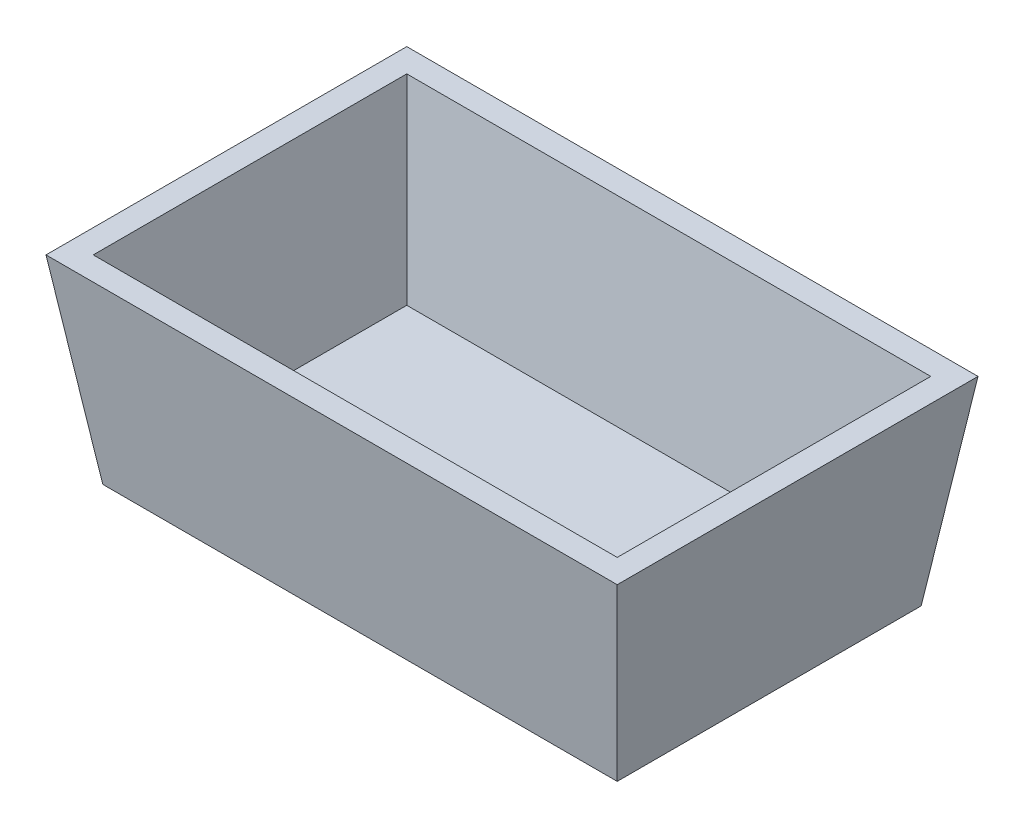
ISO-10303-21;
HEADER;
FILE_DESCRIPTION(('STEP AP214'),'2;1');
FILE_NAME('part.step','',(''),(''),'','','');
FILE_SCHEMA(('AUTOMOTIVE_DESIGN { 1 0 10303 214 1 1 1 1 }'));
ENDSEC;
DATA;
#1=APPLICATION_CONTEXT('core data for automotive mechanical design processes');
#2=APPLICATION_PROTOCOL_DEFINITION('international standard','automotive_design',2000,#1);
#3=PRODUCT_CONTEXT('',#1,'mechanical');
#4=PRODUCT('Part','Part','',(#3));
#5=PRODUCT_RELATED_PRODUCT_CATEGORY('part','',(#4));
#6=PRODUCT_DEFINITION_FORMATION('','',#4);
#7=PRODUCT_DEFINITION_CONTEXT('part definition',#1,'design');
#8=PRODUCT_DEFINITION('design','',#6,#7);
#9=PRODUCT_DEFINITION_SHAPE('','',#8);
#10=(LENGTH_UNIT() NAMED_UNIT(*) SI_UNIT(.MILLI.,.METRE.));
#11=(NAMED_UNIT(*) PLANE_ANGLE_UNIT() SI_UNIT($,.RADIAN.));
#12=(NAMED_UNIT(*) SI_UNIT($,.STERADIAN.) SOLID_ANGLE_UNIT());
#13=UNCERTAINTY_MEASURE_WITH_UNIT(LENGTH_MEASURE(1.E-05),#10,'distance_accuracy_value','');
#14=(GEOMETRIC_REPRESENTATION_CONTEXT(3) GLOBAL_UNCERTAINTY_ASSIGNED_CONTEXT((#13)) GLOBAL_UNIT_ASSIGNED_CONTEXT((#10,
#11,#12)) REPRESENTATION_CONTEXT('',''));
#15=CARTESIAN_POINT('',(0.,0.,0.));
#16=DIRECTION('',(0.,0.,1.));
#17=DIRECTION('',(1.,0.,0.));
#18=AXIS2_PLACEMENT_3D('',#15,#16,#17);
#19=CARTESIAN_POINT('',(0.,-46.2280000000001,-323.596));
#20=DIRECTION('',(0.,-0.14142135623731,-0.989949493661166));
#21=DIRECTION('',(0.,0.989949493661166,-0.14142135623731));
#22=AXIS2_PLACEMENT_3D('',#19,#20,#21);
#23=PLANE('',#22);
#24=DIRECTION('',(0.140028008402801,-0.980196058819607,0.140028008402801));
#25=VECTOR('',#24,1.);
#26=CARTESIAN_POINT('',(-38.1000000000001,266.7,-368.3));
#27=LINE('',#26,#25);
#28=CARTESIAN_POINT('',(-30.8428571428572,215.9,-361.042857142857));
#29=VERTEX_POINT('',#28);
#30=CARTESIAN_POINT('',(0.,0.,-330.2));
#31=VERTEX_POINT('',#30);
#32=EDGE_CURVE('E53',#29,#31,#27,.T.);
#33=ORIENTED_EDGE('',*,*,#32,.F.);
#34=DIRECTION('',(1.,0.,0.));
#35=VECTOR('',#34,1.);
#36=CARTESIAN_POINT('',(0.,215.9,-361.042857142857));
#37=LINE('',#36,#35);
#38=CARTESIAN_POINT('',(589.642857142857,215.9,-361.042857142857));
#39=VERTEX_POINT('',#38);
#40=EDGE_CURVE('E272',#29,#39,#37,.T.);
#41=ORIENTED_EDGE('',*,*,#40,.T.);
#42=DIRECTION('',(-0.140028008402801,-0.980196058819607,0.140028008402801));
#43=VECTOR('',#42,1.);
#44=CARTESIAN_POINT('',(596.9,266.7,-368.3));
#45=LINE('',#44,#43);
#46=CARTESIAN_POINT('',(558.8,0.,-330.2));
#47=VERTEX_POINT('',#46);
#48=EDGE_CURVE('E158',#39,#47,#45,.T.);
#49=ORIENTED_EDGE('',*,*,#48,.T.);
#50=DIRECTION('',(-1.,0.,0.));
#51=VECTOR('',#50,1.);
#52=CARTESIAN_POINT('',(0.,0.,-330.2));
#53=LINE('',#52,#51);
#54=EDGE_CURVE('E228',#47,#31,#53,.T.);
#55=ORIENTED_EDGE('',*,*,#54,.T.);
#56=EDGE_LOOP('',(#33,#41,#49,#55));
#57=FACE_BOUND('',#56,.T.);
#58=ADVANCED_FACE('F48',(#57),#23,.T.);
#59=CARTESIAN_POINT('',(0.,0.,0.));
#60=DIRECTION('',(-0.989949493661166,-0.14142135623731,0.));
#61=DIRECTION('',(0.14142135623731,-0.989949493661166,0.));
#62=AXIS2_PLACEMENT_3D('',#59,#60,#61);
#63=PLANE('',#62);
#64=DIRECTION('',(0.140028008402801,-0.980196058819607,-0.140028008402801));
#65=VECTOR('',#64,1.);
#66=CARTESIAN_POINT('',(-38.1000000000001,266.7,38.1));
#67=LINE('',#66,#65);
#68=CARTESIAN_POINT('',(-30.8428571428572,215.9,30.8428571428571));
#69=VERTEX_POINT('',#68);
#70=CARTESIAN_POINT('',(0.,0.,0.));
#71=VERTEX_POINT('',#70);
#72=EDGE_CURVE('E151',#69,#71,#67,.T.);
#73=ORIENTED_EDGE('',*,*,#72,.F.);
#74=DIRECTION('',(0.,0.,-1.));
#75=VECTOR('',#74,1.);
#76=CARTESIAN_POINT('',(-30.8428571428572,215.9,0.));
#77=LINE('',#76,#75);
#78=EDGE_CURVE('E68',#69,#29,#77,.T.);
#79=ORIENTED_EDGE('',*,*,#78,.T.);
#80=ORIENTED_EDGE('',*,*,#32,.T.);
#81=DIRECTION('',(0.,0.,1.));
#82=VECTOR('',#81,1.);
#83=CARTESIAN_POINT('',(0.,0.,0.));
#84=LINE('',#83,#82);
#85=EDGE_CURVE('E154',#31,#71,#84,.T.);
#86=ORIENTED_EDGE('',*,*,#85,.T.);
#87=EDGE_LOOP('',(#73,#79,#80,#86));
#88=FACE_BOUND('',#87,.T.);
#89=ADVANCED_FACE('F188',(#88),#63,.T.);
#90=CARTESIAN_POINT('',(547.624,-78.232,0.));
#91=DIRECTION('',(0.989949493661166,-0.14142135623731,0.));
#92=DIRECTION('',(0.14142135623731,0.989949493661167,0.));
#93=AXIS2_PLACEMENT_3D('',#90,#91,#92);
#94=PLANE('',#93);
#95=ORIENTED_EDGE('',*,*,#48,.F.);
#96=DIRECTION('',(0.,0.,1.));
#97=VECTOR('',#96,1.);
#98=CARTESIAN_POINT('',(589.642857142857,215.9,0.));
#99=LINE('',#98,#97);
#100=CARTESIAN_POINT('',(589.642857142857,215.9,30.8428571428571));
#101=VERTEX_POINT('',#100);
#102=EDGE_CURVE('E283',#39,#101,#99,.T.);
#103=ORIENTED_EDGE('',*,*,#102,.T.);
#104=DIRECTION('',(-0.140028008402801,-0.980196058819607,-0.140028008402801));
#105=VECTOR('',#104,1.);
#106=CARTESIAN_POINT('',(596.9,266.7,38.1));
#107=LINE('',#106,#105);
#108=CARTESIAN_POINT('',(558.8,0.,0.));
#109=VERTEX_POINT('',#108);
#110=EDGE_CURVE('E155',#101,#109,#107,.T.);
#111=ORIENTED_EDGE('',*,*,#110,.T.);
#112=DIRECTION('',(0.,0.,-1.));
#113=VECTOR('',#112,1.);
#114=CARTESIAN_POINT('',(558.8,0.,0.));
#115=LINE('',#114,#113);
#116=EDGE_CURVE('E212',#109,#47,#115,.T.);
#117=ORIENTED_EDGE('',*,*,#116,.T.);
#118=EDGE_LOOP('',(#95,#103,#111,#117));
#119=FACE_BOUND('',#118,.T.);
#120=ADVANCED_FACE('F184',(#119),#94,.T.);
#121=CARTESIAN_POINT('',(0.,0.,0.));
#122=DIRECTION('',(0.,-0.14142135623731,0.989949493661166));
#123=DIRECTION('',(0.,-0.989949493661167,-0.14142135623731));
#124=AXIS2_PLACEMENT_3D('',#121,#122,#123);
#125=PLANE('',#124);
#126=ORIENTED_EDGE('',*,*,#110,.F.);
#127=DIRECTION('',(-1.,0.,0.));
#128=VECTOR('',#127,1.);
#129=CARTESIAN_POINT('',(0.,215.9,30.8428571428571));
#130=LINE('',#129,#128);
#131=EDGE_CURVE('E289',#101,#69,#130,.T.);
#132=ORIENTED_EDGE('',*,*,#131,.T.);
#133=ORIENTED_EDGE('',*,*,#72,.T.);
#134=DIRECTION('',(1.,0.,0.));
#135=VECTOR('',#134,1.);
#136=CARTESIAN_POINT('',(0.,0.,0.));
#137=LINE('',#136,#135);
#138=EDGE_CURVE('E60',#71,#109,#137,.T.);
#139=ORIENTED_EDGE('',*,*,#138,.T.);
#140=EDGE_LOOP('',(#126,#132,#133,#139));
#141=FACE_BOUND('',#140,.T.);
#142=ADVANCED_FACE('F175',(#141),#125,.T.);
#143=CARTESIAN_POINT('',(0.,0.,0.));
#144=DIRECTION('',(0.,-1.,0.));
#145=DIRECTION('',(0.,0.,-1.));
#146=AXIS2_PLACEMENT_3D('',#143,#144,#145);
#147=PLANE('',#146);
#148=ORIENTED_EDGE('',*,*,#85,.F.);
#149=ORIENTED_EDGE('',*,*,#54,.F.);
#150=ORIENTED_EDGE('',*,*,#116,.F.);
#151=ORIENTED_EDGE('',*,*,#138,.F.);
#152=EDGE_LOOP('',(#148,#149,#150,#151));
#153=FACE_BOUND('',#152,.T.);
#154=ADVANCED_FACE('F50',(#153),#147,.T.);
#155=CARTESIAN_POINT('',(0.,215.9,0.));
#156=DIRECTION('',(0.,1.,0.));
#157=DIRECTION('',(0.,0.,1.));
#158=AXIS2_PLACEMENT_3D('',#155,#156,#157);
#159=PLANE('',#158);
#160=ORIENTED_EDGE('',*,*,#78,.F.);
#161=ORIENTED_EDGE('',*,*,#131,.F.);
#162=ORIENTED_EDGE('',*,*,#102,.F.);
#163=ORIENTED_EDGE('',*,*,#40,.F.);
#164=EDGE_LOOP('',(#160,#161,#162,#163));
#165=FACE_BOUND('',#164,.T.);
#166=DIRECTION('',(1.,0.,0.));
#167=VECTOR('',#166,1.);
#168=CARTESIAN_POINT('',(0.,215.9,-335.384982511231));
#169=LINE('',#168,#167);
#170=CARTESIAN_POINT('',(-5.18498251123106,215.9,-335.384982511231));
#171=VERTEX_POINT('',#170);
#172=CARTESIAN_POINT('',(563.984982511231,215.9,-335.384982511231));
#173=VERTEX_POINT('',#172);
#174=EDGE_CURVE('E129',#171,#173,#169,.T.);
#175=ORIENTED_EDGE('',*,*,#174,.T.);
#176=DIRECTION('',(0.,0.,1.));
#177=VECTOR('',#176,1.);
#178=CARTESIAN_POINT('',(563.984982511231,215.9,0.));
#179=LINE('',#178,#177);
#180=CARTESIAN_POINT('',(563.984982511231,215.9,5.18498251123099));
#181=VERTEX_POINT('',#180);
#182=EDGE_CURVE('E75',#173,#181,#179,.T.);
#183=ORIENTED_EDGE('',*,*,#182,.T.);
#184=DIRECTION('',(-1.,0.,0.));
#185=VECTOR('',#184,1.);
#186=CARTESIAN_POINT('',(0.,215.9,5.18498251123099));
#187=LINE('',#186,#185);
#188=CARTESIAN_POINT('',(-5.18498251123106,215.9,5.18498251123099));
#189=VERTEX_POINT('',#188);
#190=EDGE_CURVE('E12',#181,#189,#187,.T.);
#191=ORIENTED_EDGE('',*,*,#190,.T.);
#192=DIRECTION('',(0.,0.,-1.));
#193=VECTOR('',#192,1.);
#194=CARTESIAN_POINT('',(-5.18498251123106,215.9,0.));
#195=LINE('',#194,#193);
#196=EDGE_CURVE('E116',#189,#171,#195,.T.);
#197=ORIENTED_EDGE('',*,*,#196,.T.);
#198=EDGE_LOOP('',(#175,#183,#191,#197));
#199=FACE_BOUND('',#198,.T.);
#200=ADVANCED_FACE('F115',(#165,#199),#159,.T.);
#201=CARTESIAN_POINT('',(0.,25.4,0.));
#202=DIRECTION('',(0.,-1.,0.));
#203=DIRECTION('',(0.,0.,-1.));
#204=AXIS2_PLACEMENT_3D('',#201,#202,#203);
#205=PLANE('',#204);
#206=DIRECTION('',(0.,0.,1.));
#207=VECTOR('',#206,1.);
#208=CARTESIAN_POINT('',(22.0293032030547,25.4,0.));
#209=LINE('',#208,#207);
#210=CARTESIAN_POINT('',(22.0293032030547,25.4,-308.170696796945));
#211=VERTEX_POINT('',#210);
#212=CARTESIAN_POINT('',(22.0293032030547,25.4,-22.0293032030547));
#213=VERTEX_POINT('',#212);
#214=EDGE_CURVE('E136',#211,#213,#209,.T.);
#215=ORIENTED_EDGE('',*,*,#214,.T.);
#216=DIRECTION('',(1.,0.,0.));
#217=VECTOR('',#216,1.);
#218=CARTESIAN_POINT('',(0.,25.4,-22.0293032030547));
#219=LINE('',#218,#217);
#220=CARTESIAN_POINT('',(536.770696796945,25.4,-22.0293032030547));
#221=VERTEX_POINT('',#220);
#222=EDGE_CURVE('E133',#213,#221,#219,.T.);
#223=ORIENTED_EDGE('',*,*,#222,.T.);
#224=DIRECTION('',(0.,0.,-1.));
#225=VECTOR('',#224,1.);
#226=CARTESIAN_POINT('',(536.770696796945,25.4,0.));
#227=LINE('',#226,#225);
#228=CARTESIAN_POINT('',(536.770696796945,25.4,-308.170696796945));
#229=VERTEX_POINT('',#228);
#230=EDGE_CURVE('E260',#221,#229,#227,.T.);
#231=ORIENTED_EDGE('',*,*,#230,.T.);
#232=DIRECTION('',(-1.,0.,0.));
#233=VECTOR('',#232,1.);
#234=CARTESIAN_POINT('',(0.,25.4,-308.170696796945));
#235=LINE('',#234,#233);
#236=EDGE_CURVE('E141',#229,#211,#235,.T.);
#237=ORIENTED_EDGE('',*,*,#236,.T.);
#238=EDGE_LOOP('',(#215,#223,#231,#237));
#239=FACE_BOUND('',#238,.T.);
#240=ADVANCED_FACE('F329',(#239),#205,.F.);
#241=CARTESIAN_POINT('',(0.,3.59210244842766,-25.1447171389936));
#242=DIRECTION('',(0.,-0.14142135623731,0.989949493661166));
#243=DIRECTION('',(0.,-0.989949493661167,-0.14142135623731));
#244=AXIS2_PLACEMENT_3D('',#241,#242,#243);
#245=PLANE('',#244);
#246=ORIENTED_EDGE('',*,*,#190,.F.);
#247=DIRECTION('',(-0.140028008402801,-0.980196058819607,-0.140028008402801));
#248=VECTOR('',#247,1.);
#249=CARTESIAN_POINT('',(523.1914537853,-69.6547010815144,-35.6085462146996));
#250=LINE('',#249,#248);
#251=EDGE_CURVE('E137',#181,#221,#250,.T.);
#252=ORIENTED_EDGE('',*,*,#251,.T.);
#253=ORIENTED_EDGE('',*,*,#222,.F.);
#254=DIRECTION('',(0.140028008402801,-0.980196058819607,-0.140028008402801));
#255=VECTOR('',#254,1.);
#256=CARTESIAN_POINT('',(24.6516834696016,7.04333813417189,-24.6516834696016));
#257=LINE('',#256,#255);
#258=EDGE_CURVE('E125',#189,#213,#257,.T.);
#259=ORIENTED_EDGE('',*,*,#258,.F.);
#260=EDGE_LOOP('',(#246,#252,#253,#259));
#261=FACE_BOUND('',#260,.T.);
#262=ADVANCED_FACE('F131',(#261),#245,.F.);
#263=CARTESIAN_POINT('',(522.479282861006,-74.6398975515724,0.));
#264=DIRECTION('',(0.989949493661166,-0.14142135623731,0.));
#265=DIRECTION('',(0.14142135623731,0.989949493661167,0.));
#266=AXIS2_PLACEMENT_3D('',#263,#264,#265);
#267=PLANE('',#266);
#268=ORIENTED_EDGE('',*,*,#182,.F.);
#269=DIRECTION('',(-0.140028008402801,-0.980196058819607,0.140028008402801));
#270=VECTOR('',#269,1.);
#271=CARTESIAN_POINT('',(516.716943981379,-114.976269708965,-288.116943981379));
#272=LINE('',#271,#270);
#273=EDGE_CURVE('E270',#173,#229,#272,.T.);
#274=ORIENTED_EDGE('',*,*,#273,.T.);
#275=ORIENTED_EDGE('',*,*,#230,.F.);
#276=ORIENTED_EDGE('',*,*,#251,.F.);
#277=EDGE_LOOP('',(#268,#274,#275,#276));
#278=FACE_BOUND('',#277,.T.);
#279=ADVANCED_FACE('F296',(#278),#267,.F.);
#280=CARTESIAN_POINT('',(25.1447171389936,3.59210244842767,0.));
#281=DIRECTION('',(-0.989949493661166,-0.14142135623731,0.));
#282=DIRECTION('',(0.14142135623731,-0.989949493661166,0.));
#283=AXIS2_PLACEMENT_3D('',#280,#281,#282);
#284=PLANE('',#283);
#285=ORIENTED_EDGE('',*,*,#196,.F.);
#286=ORIENTED_EDGE('',*,*,#258,.T.);
#287=ORIENTED_EDGE('',*,*,#214,.F.);
#288=DIRECTION('',(0.140028008402801,-0.980196058819607,0.140028008402801));
#289=VECTOR('',#288,1.);
#290=CARTESIAN_POINT('',(31.1261932735232,-38.2782304932792,-299.073806726477));
#291=LINE('',#290,#289);
#292=EDGE_CURVE('E127',#171,#211,#291,.T.);
#293=ORIENTED_EDGE('',*,*,#292,.F.);
#294=EDGE_LOOP('',(#285,#286,#287,#293));
#295=FACE_BOUND('',#294,.T.);
#296=ADVANCED_FACE('F123',(#295),#284,.F.);
#297=CARTESIAN_POINT('',(0.,-42.6358975515724,-298.451282861006));
#298=DIRECTION('',(0.,-0.14142135623731,-0.989949493661166));
#299=DIRECTION('',(0.,0.989949493661166,-0.14142135623731));
#300=AXIS2_PLACEMENT_3D('',#297,#298,#299);
#301=PLANE('',#300);
#302=ORIENTED_EDGE('',*,*,#174,.F.);
#303=ORIENTED_EDGE('',*,*,#292,.T.);
#304=ORIENTED_EDGE('',*,*,#236,.F.);
#305=ORIENTED_EDGE('',*,*,#273,.F.);
#306=EDGE_LOOP('',(#302,#303,#304,#305));
#307=FACE_BOUND('',#306,.T.);
#308=ADVANCED_FACE('F297',(#307),#301,.F.);
#309=CLOSED_SHELL('',(#58,#89,#120,#142,#154,#200,#240,#262,#279,#296,#308));
#310=MANIFOLD_SOLID_BREP('B2',#309);
#311=ADVANCED_BREP_SHAPE_REPRESENTATION('',(#18,#310),#14);
#312=SHAPE_DEFINITION_REPRESENTATION(#9,#311);
ENDSEC;
END-ISO-10303-21;
